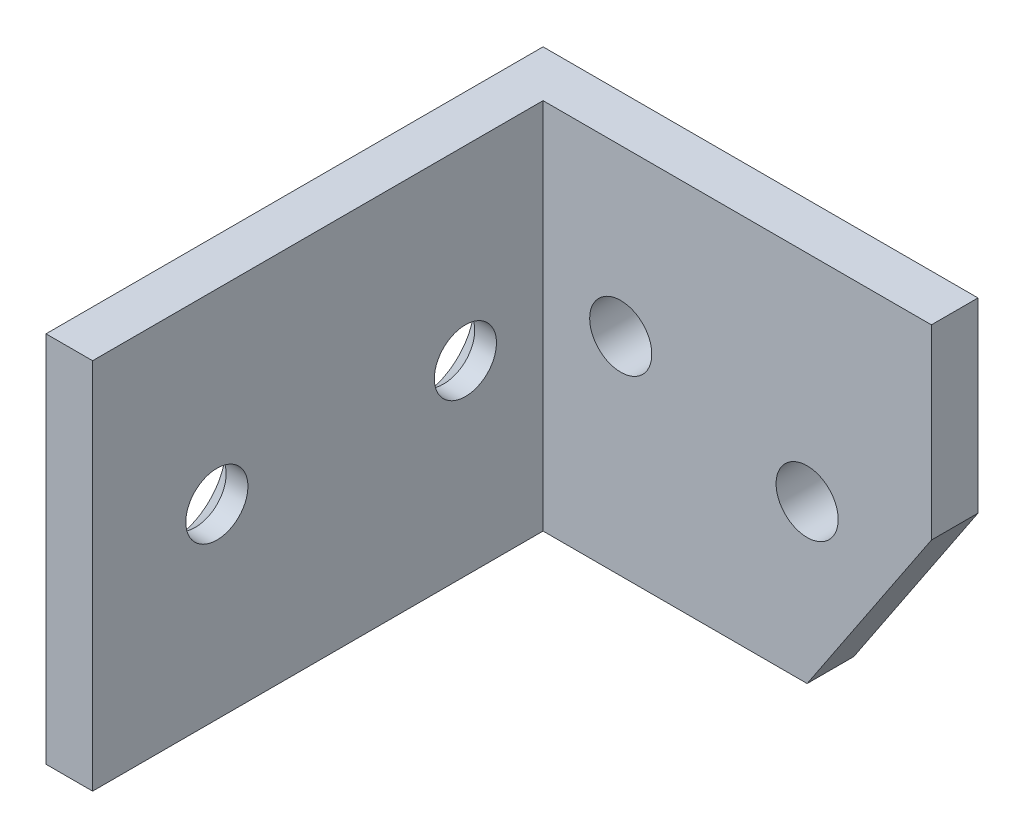
ISO-10303-21;
HEADER;
FILE_DESCRIPTION(('STEP AP214'),'2;1');
FILE_NAME('part.step','',(''),(''),'','','');
FILE_SCHEMA(('AUTOMOTIVE_DESIGN { 1 0 10303 214 1 1 1 1 }'));
ENDSEC;
DATA;
#1=APPLICATION_CONTEXT('core data for automotive mechanical design processes');
#2=APPLICATION_PROTOCOL_DEFINITION('international standard','automotive_design',2000,#1);
#3=PRODUCT_CONTEXT('',#1,'mechanical');
#4=PRODUCT('Part','Part','',(#3));
#5=PRODUCT_RELATED_PRODUCT_CATEGORY('part','',(#4));
#6=PRODUCT_DEFINITION_FORMATION('','',#4);
#7=PRODUCT_DEFINITION_CONTEXT('part definition',#1,'design');
#8=PRODUCT_DEFINITION('design','',#6,#7);
#9=PRODUCT_DEFINITION_SHAPE('','',#8);
#10=(LENGTH_UNIT() NAMED_UNIT(*) SI_UNIT(.MILLI.,.METRE.));
#11=(NAMED_UNIT(*) PLANE_ANGLE_UNIT() SI_UNIT($,.RADIAN.));
#12=(NAMED_UNIT(*) SI_UNIT($,.STERADIAN.) SOLID_ANGLE_UNIT());
#13=UNCERTAINTY_MEASURE_WITH_UNIT(LENGTH_MEASURE(1.E-05),#10,'distance_accuracy_value','');
#14=(GEOMETRIC_REPRESENTATION_CONTEXT(3) GLOBAL_UNCERTAINTY_ASSIGNED_CONTEXT((#13)) GLOBAL_UNIT_ASSIGNED_CONTEXT((#10,
#11,#12)) REPRESENTATION_CONTEXT('',''));
#15=CARTESIAN_POINT('',(0.,0.,0.));
#16=DIRECTION('',(0.,0.,1.));
#17=DIRECTION('',(1.,0.,0.));
#18=AXIS2_PLACEMENT_3D('',#15,#16,#17);
#19=CARTESIAN_POINT('',(4.7625,38.1,-46.0375));
#20=DIRECTION('',(0.,0.,-1.));
#21=DIRECTION('',(-1.,0.,0.));
#22=AXIS2_PLACEMENT_3D('',#19,#20,#21);
#23=PLANE('',#22);
#24=CARTESIAN_POINT('',(12.7,21.2073868596889,-46.0375));
#25=DIRECTION('',(0.,0.,-1.));
#26=DIRECTION('',(-1.,0.,0.));
#27=AXIS2_PLACEMENT_3D('',#24,#25,#26);
#28=CIRCLE('',#27,3.175);
#29=CARTESIAN_POINT('',(9.525,21.2073868596889,-46.0375));
#30=VERTEX_POINT('',#29);
#31=EDGE_CURVE('E131',#30,#30,#28,.F.);
#32=ORIENTED_EDGE('',*,*,#31,.F.);
#33=EDGE_LOOP('',(#32));
#34=FACE_BOUND('',#33,.T.);
#35=CARTESIAN_POINT('',(31.75,16.1029547438756,-46.0375));
#36=DIRECTION('',(0.,0.,-1.));
#37=DIRECTION('',(-1.,0.,0.));
#38=AXIS2_PLACEMENT_3D('',#35,#36,#37);
#39=CIRCLE('',#38,3.175);
#40=CARTESIAN_POINT('',(28.575,16.1029547438756,-46.0375));
#41=VERTEX_POINT('',#40);
#42=EDGE_CURVE('E125',#41,#41,#39,.F.);
#43=ORIENTED_EDGE('',*,*,#42,.F.);
#44=EDGE_LOOP('',(#43));
#45=FACE_BOUND('',#44,.T.);
#46=DIRECTION('',(-0.554700196225229,-0.832050294337844,0.));
#47=VECTOR('',#46,1.);
#48=CARTESIAN_POINT('',(41.0307692307692,13.9211538461539,-46.0375));
#49=LINE('',#48,#47);
#50=CARTESIAN_POINT('',(44.45,19.05,-46.0375));
#51=VERTEX_POINT('',#50);
#52=CARTESIAN_POINT('',(31.75,0.,-46.0375));
#53=VERTEX_POINT('',#52);
#54=EDGE_CURVE('E48',#51,#53,#49,.T.);
#55=ORIENTED_EDGE('',*,*,#54,.F.);
#56=DIRECTION('',(0.,-1.,0.));
#57=VECTOR('',#56,1.);
#58=CARTESIAN_POINT('',(44.45,38.1,-46.0375));
#59=LINE('',#58,#57);
#60=CARTESIAN_POINT('',(44.45,38.1,-46.0375));
#61=VERTEX_POINT('',#60);
#62=EDGE_CURVE('E160',#61,#51,#59,.T.);
#63=ORIENTED_EDGE('',*,*,#62,.F.);
#64=DIRECTION('',(1.,0.,0.));
#65=VECTOR('',#64,1.);
#66=CARTESIAN_POINT('',(4.7625,38.1,-46.0375));
#67=LINE('',#66,#65);
#68=CARTESIAN_POINT('',(4.7625,38.1,-46.0375));
#69=VERTEX_POINT('',#68);
#70=EDGE_CURVE('E140',#69,#61,#67,.T.);
#71=ORIENTED_EDGE('',*,*,#70,.F.);
#72=DIRECTION('',(0.,-1.,0.));
#73=VECTOR('',#72,1.);
#74=CARTESIAN_POINT('',(4.7625,38.1,-46.0375));
#75=LINE('',#74,#73);
#76=CARTESIAN_POINT('',(4.7625,0.,-46.0375));
#77=VERTEX_POINT('',#76);
#78=EDGE_CURVE('E162',#69,#77,#75,.T.);
#79=ORIENTED_EDGE('',*,*,#78,.T.);
#80=DIRECTION('',(1.,0.,0.));
#81=VECTOR('',#80,1.);
#82=CARTESIAN_POINT('',(4.7625,0.,-46.0375));
#83=LINE('',#82,#81);
#84=EDGE_CURVE('E103',#77,#53,#83,.T.);
#85=ORIENTED_EDGE('',*,*,#84,.T.);
#86=EDGE_LOOP('',(#55,#63,#71,#79,#85));
#87=FACE_BOUND('',#86,.T.);
#88=ADVANCED_FACE('F33',(#34,#45,#87),#23,.F.);
#89=CARTESIAN_POINT('',(44.45,38.1,-50.8));
#90=DIRECTION('',(-1.,0.,0.));
#91=DIRECTION('',(0.,0.,1.));
#92=AXIS2_PLACEMENT_3D('',#89,#90,#91);
#93=PLANE('',#92);
#94=DIRECTION('',(0.,0.,1.));
#95=VECTOR('',#94,1.);
#96=CARTESIAN_POINT('',(44.45,19.05,-211.189535199886));
#97=LINE('',#96,#95);
#98=CARTESIAN_POINT('',(44.45,19.05,-50.8));
#99=VERTEX_POINT('',#98);
#100=EDGE_CURVE('E55',#99,#51,#97,.T.);
#101=ORIENTED_EDGE('',*,*,#100,.F.);
#102=DIRECTION('',(0.,-1.,0.));
#103=VECTOR('',#102,1.);
#104=CARTESIAN_POINT('',(44.45,38.1,-50.8));
#105=LINE('',#104,#103);
#106=CARTESIAN_POINT('',(44.45,38.1,-50.8));
#107=VERTEX_POINT('',#106);
#108=EDGE_CURVE('E109',#107,#99,#105,.T.);
#109=ORIENTED_EDGE('',*,*,#108,.F.);
#110=DIRECTION('',(0.,0.,-1.));
#111=VECTOR('',#110,1.);
#112=CARTESIAN_POINT('',(44.45,38.1,-50.8));
#113=LINE('',#112,#111);
#114=EDGE_CURVE('E142',#61,#107,#113,.T.);
#115=ORIENTED_EDGE('',*,*,#114,.F.);
#116=ORIENTED_EDGE('',*,*,#62,.T.);
#117=EDGE_LOOP('',(#101,#109,#115,#116));
#118=FACE_BOUND('',#117,.T.);
#119=ADVANCED_FACE('F194',(#118),#93,.F.);
#120=CARTESIAN_POINT('',(0.,38.1,-50.8));
#121=DIRECTION('',(0.,0.,1.));
#122=DIRECTION('',(1.,0.,0.));
#123=AXIS2_PLACEMENT_3D('',#120,#121,#122);
#124=PLANE('',#123);
#125=CARTESIAN_POINT('',(12.7,21.2073868596889,-50.8));
#126=DIRECTION('',(0.,0.,-1.));
#127=DIRECTION('',(-1.,0.,0.));
#128=AXIS2_PLACEMENT_3D('',#125,#126,#127);
#129=CIRCLE('',#128,3.175);
#130=CARTESIAN_POINT('',(9.525,21.2073868596889,-50.8));
#131=VERTEX_POINT('',#130);
#132=EDGE_CURVE('E128',#131,#131,#129,.T.);
#133=ORIENTED_EDGE('',*,*,#132,.F.);
#134=EDGE_LOOP('',(#133));
#135=FACE_BOUND('',#134,.T.);
#136=CARTESIAN_POINT('',(31.75,16.1029547438756,-50.8));
#137=DIRECTION('',(0.,0.,-1.));
#138=DIRECTION('',(-1.,0.,0.));
#139=AXIS2_PLACEMENT_3D('',#136,#137,#138);
#140=CIRCLE('',#139,3.175);
#141=CARTESIAN_POINT('',(28.575,16.1029547438756,-50.8));
#142=VERTEX_POINT('',#141);
#143=EDGE_CURVE('E122',#142,#142,#140,.T.);
#144=ORIENTED_EDGE('',*,*,#143,.F.);
#145=EDGE_LOOP('',(#144));
#146=FACE_BOUND('',#145,.T.);
#147=DIRECTION('',(0.554700196225229,0.832050294337844,0.));
#148=VECTOR('',#147,1.);
#149=CARTESIAN_POINT('',(39.5653846153846,11.7230769230769,-50.8));
#150=LINE('',#149,#148);
#151=CARTESIAN_POINT('',(31.75,0.,-50.8));
#152=VERTEX_POINT('',#151);
#153=EDGE_CURVE('E106',#152,#99,#150,.T.);
#154=ORIENTED_EDGE('',*,*,#153,.F.);
#155=DIRECTION('',(-1.,0.,0.));
#156=VECTOR('',#155,1.);
#157=CARTESIAN_POINT('',(0.,0.,-50.8));
#158=LINE('',#157,#156);
#159=CARTESIAN_POINT('',(0.,0.,-50.8));
#160=VERTEX_POINT('',#159);
#161=EDGE_CURVE('E94',#152,#160,#158,.T.);
#162=ORIENTED_EDGE('',*,*,#161,.T.);
#163=DIRECTION('',(0.,-1.,0.));
#164=VECTOR('',#163,1.);
#165=CARTESIAN_POINT('',(0.,38.1,-50.8));
#166=LINE('',#165,#164);
#167=CARTESIAN_POINT('',(0.,38.1,-50.8));
#168=VERTEX_POINT('',#167);
#169=EDGE_CURVE('E157',#168,#160,#166,.T.);
#170=ORIENTED_EDGE('',*,*,#169,.F.);
#171=DIRECTION('',(-1.,0.,0.));
#172=VECTOR('',#171,1.);
#173=CARTESIAN_POINT('',(0.,38.1,-50.8));
#174=LINE('',#173,#172);
#175=EDGE_CURVE('E144',#107,#168,#174,.T.);
#176=ORIENTED_EDGE('',*,*,#175,.F.);
#177=ORIENTED_EDGE('',*,*,#108,.T.);
#178=EDGE_LOOP('',(#154,#162,#170,#176,#177));
#179=FACE_BOUND('',#178,.T.);
#180=ADVANCED_FACE('F107',(#135,#146,#179),#124,.F.);
#181=CARTESIAN_POINT('',(0.,0.,0.));
#182=DIRECTION('',(0.,1.,0.));
#183=DIRECTION('',(0.,0.,1.));
#184=AXIS2_PLACEMENT_3D('',#181,#182,#183);
#185=PLANE('',#184);
#186=DIRECTION('',(0.,0.,-1.));
#187=VECTOR('',#186,1.);
#188=CARTESIAN_POINT('',(31.75,0.,0.));
#189=LINE('',#188,#187);
#190=EDGE_CURVE('E11',#53,#152,#189,.T.);
#191=ORIENTED_EDGE('',*,*,#190,.F.);
#192=ORIENTED_EDGE('',*,*,#84,.F.);
#193=DIRECTION('',(0.,0.,-1.));
#194=VECTOR('',#193,1.);
#195=CARTESIAN_POINT('',(4.7625,0.,0.));
#196=LINE('',#195,#194);
#197=CARTESIAN_POINT('',(4.7625,0.,0.));
#198=VERTEX_POINT('',#197);
#199=EDGE_CURVE('E151',#198,#77,#196,.T.);
#200=ORIENTED_EDGE('',*,*,#199,.F.);
#201=DIRECTION('',(1.,0.,0.));
#202=VECTOR('',#201,1.);
#203=CARTESIAN_POINT('',(0.,0.,0.));
#204=LINE('',#203,#202);
#205=CARTESIAN_POINT('',(0.,0.,0.));
#206=VERTEX_POINT('',#205);
#207=EDGE_CURVE('E134',#206,#198,#204,.T.);
#208=ORIENTED_EDGE('',*,*,#207,.F.);
#209=DIRECTION('',(0.,0.,1.));
#210=VECTOR('',#209,1.);
#211=CARTESIAN_POINT('',(0.,0.,0.));
#212=LINE('',#211,#210);
#213=EDGE_CURVE('E99',#160,#206,#212,.T.);
#214=ORIENTED_EDGE('',*,*,#213,.F.);
#215=ORIENTED_EDGE('',*,*,#161,.F.);
#216=EDGE_LOOP('',(#191,#192,#200,#208,#214,#215));
#217=FACE_BOUND('',#216,.T.);
#218=ADVANCED_FACE('F96',(#217),#185,.F.);
#219=CARTESIAN_POINT('',(0.,38.1,0.));
#220=DIRECTION('',(0.,0.,-1.));
#221=DIRECTION('',(-1.,0.,0.));
#222=AXIS2_PLACEMENT_3D('',#219,#220,#221);
#223=PLANE('',#222);
#224=ORIENTED_EDGE('',*,*,#207,.T.);
#225=DIRECTION('',(0.,-1.,0.));
#226=VECTOR('',#225,1.);
#227=CARTESIAN_POINT('',(4.7625,38.1,0.));
#228=LINE('',#227,#226);
#229=CARTESIAN_POINT('',(4.7625,38.1,0.));
#230=VERTEX_POINT('',#229);
#231=EDGE_CURVE('E165',#230,#198,#228,.T.);
#232=ORIENTED_EDGE('',*,*,#231,.F.);
#233=DIRECTION('',(1.,0.,0.));
#234=VECTOR('',#233,1.);
#235=CARTESIAN_POINT('',(0.,38.1,0.));
#236=LINE('',#235,#234);
#237=CARTESIAN_POINT('',(0.,38.1,0.));
#238=VERTEX_POINT('',#237);
#239=EDGE_CURVE('E135',#238,#230,#236,.T.);
#240=ORIENTED_EDGE('',*,*,#239,.F.);
#241=DIRECTION('',(0.,-1.,0.));
#242=VECTOR('',#241,1.);
#243=CARTESIAN_POINT('',(0.,38.1,0.));
#244=LINE('',#243,#242);
#245=EDGE_CURVE('E148',#238,#206,#244,.T.);
#246=ORIENTED_EDGE('',*,*,#245,.T.);
#247=EDGE_LOOP('',(#224,#232,#240,#246));
#248=FACE_BOUND('',#247,.T.);
#249=ADVANCED_FACE('F209',(#248),#223,.F.);
#250=CARTESIAN_POINT('',(4.7625,38.1,0.));
#251=DIRECTION('',(-1.,0.,0.));
#252=DIRECTION('',(0.,0.,1.));
#253=AXIS2_PLACEMENT_3D('',#250,#251,#252);
#254=PLANE('',#253);
#255=CARTESIAN_POINT('',(4.7625,19.05,-38.1));
#256=DIRECTION('',(-1.,0.,0.));
#257=DIRECTION('',(0.,0.,1.));
#258=AXIS2_PLACEMENT_3D('',#255,#256,#257);
#259=CIRCLE('',#258,3.175);
#260=CARTESIAN_POINT('',(4.7625,19.05,-34.925));
#261=VERTEX_POINT('',#260);
#262=EDGE_CURVE('E113',#261,#261,#259,.F.);
#263=ORIENTED_EDGE('',*,*,#262,.F.);
#264=EDGE_LOOP('',(#263));
#265=FACE_BOUND('',#264,.T.);
#266=CARTESIAN_POINT('',(4.7625,19.05,-12.7));
#267=DIRECTION('',(-1.,0.,0.));
#268=DIRECTION('',(0.,0.,1.));
#269=AXIS2_PLACEMENT_3D('',#266,#267,#268);
#270=CIRCLE('',#269,3.175);
#271=CARTESIAN_POINT('',(4.7625,19.05,-9.525));
#272=VERTEX_POINT('',#271);
#273=EDGE_CURVE('E116',#272,#272,#270,.F.);
#274=ORIENTED_EDGE('',*,*,#273,.F.);
#275=EDGE_LOOP('',(#274));
#276=FACE_BOUND('',#275,.T.);
#277=ORIENTED_EDGE('',*,*,#199,.T.);
#278=ORIENTED_EDGE('',*,*,#78,.F.);
#279=DIRECTION('',(0.,0.,-1.));
#280=VECTOR('',#279,1.);
#281=CARTESIAN_POINT('',(4.7625,38.1,0.));
#282=LINE('',#281,#280);
#283=EDGE_CURVE('E138',#230,#69,#282,.T.);
#284=ORIENTED_EDGE('',*,*,#283,.F.);
#285=ORIENTED_EDGE('',*,*,#231,.T.);
#286=EDGE_LOOP('',(#277,#278,#284,#285));
#287=FACE_BOUND('',#286,.T.);
#288=ADVANCED_FACE('F205',(#265,#276,#287),#254,.F.);
#289=CARTESIAN_POINT('',(0.,38.1,0.));
#290=DIRECTION('',(1.,0.,0.));
#291=DIRECTION('',(0.,0.,-1.));
#292=AXIS2_PLACEMENT_3D('',#289,#290,#291);
#293=PLANE('',#292);
#294=CARTESIAN_POINT('',(0.,19.05,-12.7));
#295=DIRECTION('',(1.,0.,0.));
#296=DIRECTION('',(0.,0.,-1.));
#297=AXIS2_PLACEMENT_3D('',#294,#295,#296);
#298=CIRCLE('',#297,5.71500000000001);
#299=CARTESIAN_POINT('',(0.,19.05,-18.415));
#300=VERTEX_POINT('',#299);
#301=EDGE_CURVE('E174',#300,#300,#298,.T.);
#302=ORIENTED_EDGE('',*,*,#301,.T.);
#303=EDGE_LOOP('',(#302));
#304=FACE_BOUND('',#303,.T.);
#305=CARTESIAN_POINT('',(0.,19.05,-38.1));
#306=DIRECTION('',(1.,0.,0.));
#307=DIRECTION('',(0.,0.,-1.));
#308=AXIS2_PLACEMENT_3D('',#305,#306,#307);
#309=CIRCLE('',#308,5.71500000000003);
#310=CARTESIAN_POINT('',(0.,19.05,-43.815));
#311=VERTEX_POINT('',#310);
#312=EDGE_CURVE('E171',#311,#311,#309,.T.);
#313=ORIENTED_EDGE('',*,*,#312,.T.);
#314=EDGE_LOOP('',(#313));
#315=FACE_BOUND('',#314,.T.);
#316=ORIENTED_EDGE('',*,*,#213,.T.);
#317=ORIENTED_EDGE('',*,*,#245,.F.);
#318=DIRECTION('',(0.,0.,1.));
#319=VECTOR('',#318,1.);
#320=CARTESIAN_POINT('',(0.,38.1,0.));
#321=LINE('',#320,#319);
#322=EDGE_CURVE('E146',#168,#238,#321,.T.);
#323=ORIENTED_EDGE('',*,*,#322,.F.);
#324=ORIENTED_EDGE('',*,*,#169,.T.);
#325=EDGE_LOOP('',(#316,#317,#323,#324));
#326=FACE_BOUND('',#325,.T.);
#327=ADVANCED_FACE('F208',(#304,#315,#326),#293,.F.);
#328=CARTESIAN_POINT('',(0.,38.1,0.));
#329=DIRECTION('',(0.,1.,0.));
#330=DIRECTION('',(0.,0.,1.));
#331=AXIS2_PLACEMENT_3D('',#328,#329,#330);
#332=PLANE('',#331);
#333=ORIENTED_EDGE('',*,*,#239,.T.);
#334=ORIENTED_EDGE('',*,*,#283,.T.);
#335=ORIENTED_EDGE('',*,*,#70,.T.);
#336=ORIENTED_EDGE('',*,*,#114,.T.);
#337=ORIENTED_EDGE('',*,*,#175,.T.);
#338=ORIENTED_EDGE('',*,*,#322,.T.);
#339=EDGE_LOOP('',(#333,#334,#335,#336,#337,#338));
#340=FACE_BOUND('',#339,.T.);
#341=ADVANCED_FACE('F224',(#340),#332,.T.);
#342=CARTESIAN_POINT('',(12.7,21.2073868596889,0.001000000000001));
#343=DIRECTION('',(0.,0.,-1.));
#344=DIRECTION('',(-1.,0.,0.));
#345=AXIS2_PLACEMENT_3D('',#342,#343,#344);
#346=CYLINDRICAL_SURFACE('',#345,3.175);
#347=ORIENTED_EDGE('',*,*,#132,.T.);
#348=EDGE_LOOP('',(#347));
#349=FACE_BOUND('',#348,.T.);
#350=ORIENTED_EDGE('',*,*,#31,.T.);
#351=EDGE_LOOP('',(#350));
#352=FACE_BOUND('',#351,.T.);
#353=ADVANCED_FACE('F235',(#349,#352),#346,.F.);
#354=CARTESIAN_POINT('',(31.75,16.1029547438756,0.001000000000001));
#355=DIRECTION('',(0.,0.,-1.));
#356=DIRECTION('',(-1.,0.,0.));
#357=AXIS2_PLACEMENT_3D('',#354,#355,#356);
#358=CYLINDRICAL_SURFACE('',#357,3.175);
#359=ORIENTED_EDGE('',*,*,#143,.T.);
#360=EDGE_LOOP('',(#359));
#361=FACE_BOUND('',#360,.T.);
#362=ORIENTED_EDGE('',*,*,#42,.T.);
#363=EDGE_LOOP('',(#362));
#364=FACE_BOUND('',#363,.T.);
#365=ADVANCED_FACE('F246',(#361,#364),#358,.F.);
#366=CARTESIAN_POINT('',(44.451,19.05,-12.7));
#367=DIRECTION('',(-1.,0.,0.));
#368=DIRECTION('',(0.,0.,1.));
#369=AXIS2_PLACEMENT_3D('',#366,#367,#368);
#370=CYLINDRICAL_SURFACE('',#369,3.175);
#371=CARTESIAN_POINT('',(2.53999999999999,19.05,-12.7));
#372=DIRECTION('',(1.,0.,0.));
#373=DIRECTION('',(0.,0.,-1.));
#374=AXIS2_PLACEMENT_3D('',#371,#372,#373);
#375=CIRCLE('',#374,3.175);
#376=CARTESIAN_POINT('',(2.53999999999999,19.05,-15.875));
#377=VERTEX_POINT('',#376);
#378=EDGE_CURVE('E168',#377,#377,#375,.F.);
#379=ORIENTED_EDGE('',*,*,#378,.T.);
#380=EDGE_LOOP('',(#379));
#381=FACE_BOUND('',#380,.T.);
#382=ORIENTED_EDGE('',*,*,#273,.T.);
#383=EDGE_LOOP('',(#382));
#384=FACE_BOUND('',#383,.T.);
#385=ADVANCED_FACE('F249',(#381,#384),#370,.F.);
#386=CARTESIAN_POINT('',(44.451,19.05,-38.1));
#387=DIRECTION('',(-1.,0.,0.));
#388=DIRECTION('',(0.,0.,1.));
#389=AXIS2_PLACEMENT_3D('',#386,#387,#388);
#390=CYLINDRICAL_SURFACE('',#389,3.175);
#391=CARTESIAN_POINT('',(2.54000000000001,19.05,-38.1));
#392=DIRECTION('',(1.,0.,0.));
#393=DIRECTION('',(0.,0.,-1.));
#394=AXIS2_PLACEMENT_3D('',#391,#392,#393);
#395=CIRCLE('',#394,3.175);
#396=CARTESIAN_POINT('',(2.54000000000001,19.05,-41.275));
#397=VERTEX_POINT('',#396);
#398=EDGE_CURVE('E41',#397,#397,#395,.F.);
#399=ORIENTED_EDGE('',*,*,#398,.T.);
#400=EDGE_LOOP('',(#399));
#401=FACE_BOUND('',#400,.T.);
#402=ORIENTED_EDGE('',*,*,#262,.T.);
#403=EDGE_LOOP('',(#402));
#404=FACE_BOUND('',#403,.T.);
#405=ADVANCED_FACE('F179',(#401,#404),#390,.F.);
#406=CARTESIAN_POINT('',(2.53999999999999,19.05,-12.7));
#407=DIRECTION('',(-1.,0.,0.));
#408=DIRECTION('',(0.,0.,1.));
#409=AXIS2_PLACEMENT_3D('',#406,#407,#408);
#410=CONICAL_SURFACE('',#409,3.175,0.78539816339745);
#411=ORIENTED_EDGE('',*,*,#301,.F.);
#412=EDGE_LOOP('',(#411));
#413=FACE_BOUND('',#412,.T.);
#414=ORIENTED_EDGE('',*,*,#378,.F.);
#415=EDGE_LOOP('',(#414));
#416=FACE_BOUND('',#415,.T.);
#417=ADVANCED_FACE('F183',(#413,#416),#410,.F.);
#418=CARTESIAN_POINT('',(2.54000000000001,19.05,-38.1));
#419=DIRECTION('',(-1.,0.,0.));
#420=DIRECTION('',(0.,0.,1.));
#421=AXIS2_PLACEMENT_3D('',#418,#419,#420);
#422=CONICAL_SURFACE('',#421,3.175,0.785398163397451);
#423=ORIENTED_EDGE('',*,*,#312,.F.);
#424=EDGE_LOOP('',(#423));
#425=FACE_BOUND('',#424,.T.);
#426=ORIENTED_EDGE('',*,*,#398,.F.);
#427=EDGE_LOOP('',(#426));
#428=FACE_BOUND('',#427,.T.);
#429=ADVANCED_FACE('F35',(#425,#428),#422,.F.);
#430=CARTESIAN_POINT('',(31.75,0.,-211.189535199886));
#431=DIRECTION('',(0.832050294337844,-0.554700196225229,0.));
#432=DIRECTION('',(0.554700196225229,0.832050294337844,0.));
#433=AXIS2_PLACEMENT_3D('',#430,#431,#432);
#434=PLANE('',#433);
#435=ORIENTED_EDGE('',*,*,#100,.T.);
#436=ORIENTED_EDGE('',*,*,#54,.T.);
#437=ORIENTED_EDGE('',*,*,#190,.T.);
#438=ORIENTED_EDGE('',*,*,#153,.T.);
#439=EDGE_LOOP('',(#435,#436,#437,#438));
#440=FACE_BOUND('',#439,.T.);
#441=ADVANCED_FACE('F112',(#440),#434,.T.);
#442=CLOSED_SHELL('',(#88,#119,#180,#218,#249,#288,#327,#341,#353,#365,#385,#405,#417,#429,#441));
#443=MANIFOLD_SOLID_BREP('B2',#442);
#444=ADVANCED_BREP_SHAPE_REPRESENTATION('',(#18,#443),#14);
#445=SHAPE_DEFINITION_REPRESENTATION(#9,#444);
ENDSEC;
END-ISO-10303-21;
